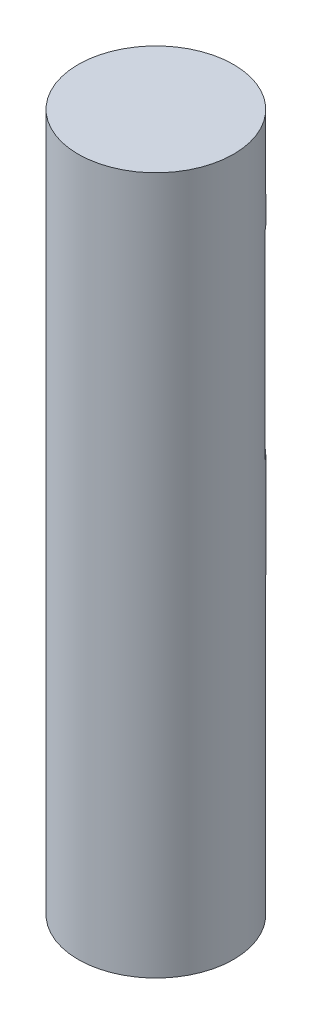
ISO-10303-21;
HEADER;
FILE_DESCRIPTION(('STEP AP214'),'2;1');
FILE_NAME('part.step','',(''),(''),'','','');
FILE_SCHEMA(('AUTOMOTIVE_DESIGN { 1 0 10303 214 1 1 1 1 }'));
ENDSEC;
DATA;
#1=APPLICATION_CONTEXT('core data for automotive mechanical design processes');
#2=APPLICATION_PROTOCOL_DEFINITION('international standard','automotive_design',2000,#1);
#3=PRODUCT_CONTEXT('',#1,'mechanical');
#4=PRODUCT('Part','Part','',(#3));
#5=PRODUCT_RELATED_PRODUCT_CATEGORY('part','',(#4));
#6=PRODUCT_DEFINITION_FORMATION('','',#4);
#7=PRODUCT_DEFINITION_CONTEXT('part definition',#1,'design');
#8=PRODUCT_DEFINITION('design','',#6,#7);
#9=PRODUCT_DEFINITION_SHAPE('','',#8);
#10=(LENGTH_UNIT() NAMED_UNIT(*) SI_UNIT(.MILLI.,.METRE.));
#11=(NAMED_UNIT(*) PLANE_ANGLE_UNIT() SI_UNIT($,.RADIAN.));
#12=(NAMED_UNIT(*) SI_UNIT($,.STERADIAN.) SOLID_ANGLE_UNIT());
#13=UNCERTAINTY_MEASURE_WITH_UNIT(LENGTH_MEASURE(1.E-05),#10,'distance_accuracy_value','');
#14=(GEOMETRIC_REPRESENTATION_CONTEXT(3) GLOBAL_UNCERTAINTY_ASSIGNED_CONTEXT((#13)) GLOBAL_UNIT_ASSIGNED_CONTEXT((#10,
#11,#12)) REPRESENTATION_CONTEXT('',''));
#15=CARTESIAN_POINT('',(0.,0.,0.));
#16=DIRECTION('',(0.,0.,1.));
#17=DIRECTION('',(1.,0.,0.));
#18=AXIS2_PLACEMENT_3D('',#15,#16,#17);
#19=CARTESIAN_POINT('',(-3.94109236126229,44.45,-3.));
#20=DIRECTION('',(0.,0.,1.));
#21=DIRECTION('',(1.,0.,0.));
#22=AXIS2_PLACEMENT_3D('',#19,#20,#21);
#23=PLANE('',#22);
#24=DIRECTION('',(0.,-1.,0.));
#25=VECTOR('',#24,1.);
#26=CARTESIAN_POINT('',(-3.94109236126229,44.45,-3.));
#27=LINE('',#26,#25);
#28=CARTESIAN_POINT('',(-3.94109236126229,38.1,-3.));
#29=VERTEX_POINT('',#28);
#30=CARTESIAN_POINT('',(-3.94109236126229,25.4,-3.));
#31=VERTEX_POINT('',#30);
#32=EDGE_CURVE('E45',#29,#31,#27,.T.);
#33=ORIENTED_EDGE('',*,*,#32,.F.);
#34=DIRECTION('',(1.,0.,0.));
#35=VECTOR('',#34,1.);
#36=CARTESIAN_POINT('',(-3.94109236126229,38.1,-3.));
#37=LINE('',#36,#35);
#38=CARTESIAN_POINT('',(3.94109236126229,38.1,-3.));
#39=VERTEX_POINT('',#38);
#40=EDGE_CURVE('E65',#29,#39,#37,.T.);
#41=ORIENTED_EDGE('',*,*,#40,.T.);
#42=DIRECTION('',(0.,-1.,0.));
#43=VECTOR('',#42,1.);
#44=CARTESIAN_POINT('',(3.94109236126229,44.45,-3.));
#45=LINE('',#44,#43);
#46=CARTESIAN_POINT('',(3.94109236126229,25.4,-3.));
#47=VERTEX_POINT('',#46);
#48=EDGE_CURVE('E11',#39,#47,#45,.T.);
#49=ORIENTED_EDGE('',*,*,#48,.T.);
#50=DIRECTION('',(-1.,0.,0.));
#51=VECTOR('',#50,1.);
#52=CARTESIAN_POINT('',(-3.94109236126229,25.4,-3.));
#53=LINE('',#52,#51);
#54=EDGE_CURVE('E71',#47,#31,#53,.T.);
#55=ORIENTED_EDGE('',*,*,#54,.T.);
#56=EDGE_LOOP('',(#33,#41,#49,#55));
#57=FACE_BOUND('',#56,.T.);
#58=ADVANCED_FACE('F37',(#57),#23,.F.);
#59=CARTESIAN_POINT('',(0.,44.45,0.));
#60=DIRECTION('',(0.,-1.,0.));
#61=DIRECTION('',(0.,0.,-1.));
#62=AXIS2_PLACEMENT_3D('',#59,#60,#61);
#63=CYLINDRICAL_SURFACE('',#62,4.953);
#64=CARTESIAN_POINT('',(0.,38.1,0.));
#65=DIRECTION('',(0.,1.,0.));
#66=DIRECTION('',(0.,0.,-1.));
#67=AXIS2_PLACEMENT_3D('',#64,#65,#66);
#68=CIRCLE('',#67,4.953);
#69=EDGE_CURVE('E61',#39,#29,#68,.T.);
#70=ORIENTED_EDGE('',*,*,#69,.T.);
#71=ORIENTED_EDGE('',*,*,#32,.T.);
#72=CARTESIAN_POINT('',(0.,25.4,0.));
#73=DIRECTION('',(0.,-1.,0.));
#74=DIRECTION('',(0.,0.,-1.));
#75=AXIS2_PLACEMENT_3D('',#72,#73,#74);
#76=CIRCLE('',#75,4.953);
#77=EDGE_CURVE('E68',#31,#47,#76,.T.);
#78=ORIENTED_EDGE('',*,*,#77,.T.);
#79=ORIENTED_EDGE('',*,*,#48,.F.);
#80=EDGE_LOOP('',(#70,#71,#78,#79));
#81=FACE_BOUND('',#80,.T.);
#82=CARTESIAN_POINT('',(0.,0.,0.));
#83=DIRECTION('',(0.,1.,0.));
#84=DIRECTION('',(0.,0.,1.));
#85=AXIS2_PLACEMENT_3D('',#82,#83,#84);
#86=CIRCLE('',#85,4.953);
#87=CARTESIAN_POINT('',(0.,0.,4.953));
#88=VERTEX_POINT('',#87);
#89=EDGE_CURVE('E75',#88,#88,#86,.T.);
#90=ORIENTED_EDGE('',*,*,#89,.T.);
#91=EDGE_LOOP('',(#90));
#92=FACE_BOUND('',#91,.T.);
#93=CARTESIAN_POINT('',(0.,44.45,0.));
#94=DIRECTION('',(0.,1.,0.));
#95=DIRECTION('',(0.,0.,1.));
#96=AXIS2_PLACEMENT_3D('',#93,#94,#95);
#97=CIRCLE('',#96,4.953);
#98=CARTESIAN_POINT('',(0.,44.45,4.953));
#99=VERTEX_POINT('',#98);
#100=EDGE_CURVE('E73',#99,#99,#97,.T.);
#101=ORIENTED_EDGE('',*,*,#100,.F.);
#102=EDGE_LOOP('',(#101));
#103=FACE_BOUND('',#102,.T.);
#104=ADVANCED_FACE('F39',(#81,#92,#103),#63,.T.);
#105=CARTESIAN_POINT('',(0.,44.45,0.));
#106=DIRECTION('',(0.,1.,0.));
#107=DIRECTION('',(0.,0.,1.));
#108=AXIS2_PLACEMENT_3D('',#105,#106,#107);
#109=PLANE('',#108);
#110=ORIENTED_EDGE('',*,*,#100,.T.);
#111=EDGE_LOOP('',(#110));
#112=FACE_BOUND('',#111,.T.);
#113=ADVANCED_FACE('F91',(#112),#109,.T.);
#114=CARTESIAN_POINT('',(0.,0.,0.));
#115=DIRECTION('',(0.,1.,0.));
#116=DIRECTION('',(0.,0.,1.));
#117=AXIS2_PLACEMENT_3D('',#114,#115,#116);
#118=PLANE('',#117);
#119=ORIENTED_EDGE('',*,*,#89,.F.);
#120=EDGE_LOOP('',(#119));
#121=FACE_BOUND('',#120,.T.);
#122=ADVANCED_FACE('F84',(#121),#118,.F.);
#123=CARTESIAN_POINT('',(0.,25.4,0.));
#124=DIRECTION('',(0.,-1.,0.));
#125=DIRECTION('',(0.,0.,-1.));
#126=AXIS2_PLACEMENT_3D('',#123,#124,#125);
#127=PLANE('',#126);
#128=ORIENTED_EDGE('',*,*,#77,.F.);
#129=ORIENTED_EDGE('',*,*,#54,.F.);
#130=EDGE_LOOP('',(#128,#129));
#131=FACE_BOUND('',#130,.T.);
#132=ADVANCED_FACE('F82',(#131),#127,.F.);
#133=CARTESIAN_POINT('',(0.,38.1,0.));
#134=DIRECTION('',(0.,-1.,0.));
#135=DIRECTION('',(0.,0.,-1.));
#136=AXIS2_PLACEMENT_3D('',#133,#134,#135);
#137=PLANE('',#136);
#138=ORIENTED_EDGE('',*,*,#69,.F.);
#139=ORIENTED_EDGE('',*,*,#40,.F.);
#140=EDGE_LOOP('',(#138,#139));
#141=FACE_BOUND('',#140,.T.);
#142=ADVANCED_FACE('F67',(#141),#137,.T.);
#143=CLOSED_SHELL('',(#58,#104,#113,#122,#132,#142));
#144=MANIFOLD_SOLID_BREP('B2',#143);
#145=ADVANCED_BREP_SHAPE_REPRESENTATION('',(#18,#144),#14);
#146=SHAPE_DEFINITION_REPRESENTATION(#9,#145);
ENDSEC;
END-ISO-10303-21;
